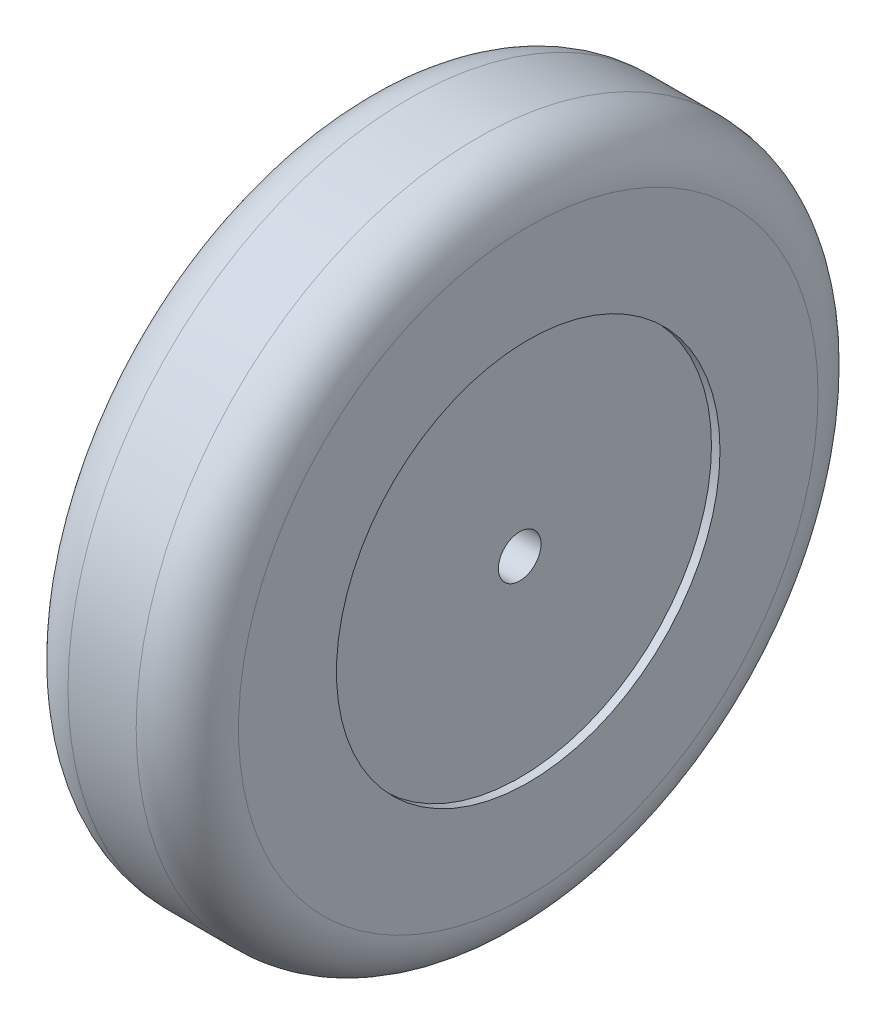
ISO-10303-21;
HEADER;
FILE_DESCRIPTION(('STEP AP214'),'2;1');
FILE_NAME('part.step','',(''),(''),'','','');
FILE_SCHEMA(('AUTOMOTIVE_DESIGN { 1 0 10303 214 1 1 1 1 }'));
ENDSEC;
DATA;
#1=APPLICATION_CONTEXT('core data for automotive mechanical design processes');
#2=APPLICATION_PROTOCOL_DEFINITION('international standard','automotive_design',2000,#1);
#3=PRODUCT_CONTEXT('',#1,'mechanical');
#4=PRODUCT('Part','Part','',(#3));
#5=PRODUCT_RELATED_PRODUCT_CATEGORY('part','',(#4));
#6=PRODUCT_DEFINITION_FORMATION('','',#4);
#7=PRODUCT_DEFINITION_CONTEXT('part definition',#1,'design');
#8=PRODUCT_DEFINITION('design','',#6,#7);
#9=PRODUCT_DEFINITION_SHAPE('','',#8);
#10=(LENGTH_UNIT() NAMED_UNIT(*) SI_UNIT(.MILLI.,.METRE.));
#11=(NAMED_UNIT(*) PLANE_ANGLE_UNIT() SI_UNIT($,.RADIAN.));
#12=(NAMED_UNIT(*) SI_UNIT($,.STERADIAN.) SOLID_ANGLE_UNIT());
#13=UNCERTAINTY_MEASURE_WITH_UNIT(LENGTH_MEASURE(1.E-05),#10,'distance_accuracy_value','');
#14=(GEOMETRIC_REPRESENTATION_CONTEXT(3) GLOBAL_UNCERTAINTY_ASSIGNED_CONTEXT((#13)) GLOBAL_UNIT_ASSIGNED_CONTEXT((#10,
#11,#12)) REPRESENTATION_CONTEXT('',''));
#15=CARTESIAN_POINT('',(0.,0.,0.));
#16=DIRECTION('',(0.,0.,1.));
#17=DIRECTION('',(1.,0.,0.));
#18=AXIS2_PLACEMENT_3D('',#15,#16,#17);
#19=CARTESIAN_POINT('',(-12.7,0.,0.));
#20=DIRECTION('',(1.,0.,0.));
#21=DIRECTION('',(0.,0.,-1.));
#22=AXIS2_PLACEMENT_3D('',#19,#20,#21);
#23=CYLINDRICAL_SURFACE('',#22,3.175);
#24=CARTESIAN_POINT('',(11.43,0.,0.));
#25=DIRECTION('',(1.,0.,0.));
#26=DIRECTION('',(0.,0.,-1.));
#27=AXIS2_PLACEMENT_3D('',#24,#25,#26);
#28=CIRCLE('',#27,3.175);
#29=CARTESIAN_POINT('',(11.43,0.,-3.175));
#30=VERTEX_POINT('',#29);
#31=EDGE_CURVE('E67',#30,#30,#28,.F.);
#32=ORIENTED_EDGE('',*,*,#31,.F.);
#33=EDGE_LOOP('',(#32));
#34=FACE_BOUND('',#33,.T.);
#35=CARTESIAN_POINT('',(-11.43,0.,0.));
#36=DIRECTION('',(-1.,0.,0.));
#37=DIRECTION('',(0.,0.,1.));
#38=AXIS2_PLACEMENT_3D('',#35,#36,#37);
#39=CIRCLE('',#38,3.175);
#40=CARTESIAN_POINT('',(-11.43,0.,3.175));
#41=VERTEX_POINT('',#40);
#42=EDGE_CURVE('E53',#41,#41,#39,.F.);
#43=ORIENTED_EDGE('',*,*,#42,.F.);
#44=EDGE_LOOP('',(#43));
#45=FACE_BOUND('',#44,.T.);
#46=ADVANCED_FACE('F49',(#34,#45),#23,.F.);
#47=CARTESIAN_POINT('',(12.7,0.,0.));
#48=DIRECTION('',(-1.,0.,0.));
#49=DIRECTION('',(0.,0.,1.));
#50=AXIS2_PLACEMENT_3D('',#47,#48,#49);
#51=CYLINDRICAL_SURFACE('',#50,50.8);
#52=CARTESIAN_POINT('',(-5.08,0.,0.));
#53=DIRECTION('',(1.,0.,0.));
#54=DIRECTION('',(0.,0.,-1.));
#55=AXIS2_PLACEMENT_3D('',#52,#53,#54);
#56=CIRCLE('',#55,50.8);
#57=CARTESIAN_POINT('',(-5.08,0.,-50.8));
#58=VERTEX_POINT('',#57);
#59=EDGE_CURVE('E64',#58,#58,#56,.T.);
#60=ORIENTED_EDGE('',*,*,#59,.T.);
#61=EDGE_LOOP('',(#60));
#62=FACE_BOUND('',#61,.T.);
#63=CARTESIAN_POINT('',(5.08,0.,0.));
#64=DIRECTION('',(1.,0.,0.));
#65=DIRECTION('',(0.,0.,-1.));
#66=AXIS2_PLACEMENT_3D('',#63,#64,#65);
#67=CIRCLE('',#66,50.8);
#68=CARTESIAN_POINT('',(5.08,0.,-50.8));
#69=VERTEX_POINT('',#68);
#70=EDGE_CURVE('E70',#69,#69,#67,.F.);
#71=ORIENTED_EDGE('',*,*,#70,.T.);
#72=EDGE_LOOP('',(#71));
#73=FACE_BOUND('',#72,.T.);
#74=ADVANCED_FACE('F93',(#62,#73),#51,.T.);
#75=CARTESIAN_POINT('',(12.7,0.,0.));
#76=DIRECTION('',(1.,0.,0.));
#77=DIRECTION('',(0.,0.,-1.));
#78=AXIS2_PLACEMENT_3D('',#75,#76,#77);
#79=PLANE('',#78);
#80=CARTESIAN_POINT('',(12.7,0.,0.));
#81=DIRECTION('',(1.,0.,0.));
#82=DIRECTION('',(0.,0.,-1.));
#83=AXIS2_PLACEMENT_3D('',#80,#81,#82);
#84=CIRCLE('',#83,28.575);
#85=CARTESIAN_POINT('',(12.7,0.,-28.575));
#86=VERTEX_POINT('',#85);
#87=EDGE_CURVE('E79',#86,#86,#84,.T.);
#88=ORIENTED_EDGE('',*,*,#87,.F.);
#89=EDGE_LOOP('',(#88));
#90=FACE_BOUND('',#89,.T.);
#91=CARTESIAN_POINT('',(12.7,0.,0.));
#92=DIRECTION('',(1.,0.,0.));
#93=DIRECTION('',(0.,0.,-1.));
#94=AXIS2_PLACEMENT_3D('',#91,#92,#93);
#95=CIRCLE('',#94,43.18);
#96=CARTESIAN_POINT('',(12.7,0.,-43.18));
#97=VERTEX_POINT('',#96);
#98=EDGE_CURVE('E10',#97,#97,#95,.T.);
#99=ORIENTED_EDGE('',*,*,#98,.T.);
#100=EDGE_LOOP('',(#99));
#101=FACE_BOUND('',#100,.T.);
#102=ADVANCED_FACE('F107',(#90,#101),#79,.T.);
#103=CARTESIAN_POINT('',(-12.7,0.,0.));
#104=DIRECTION('',(1.,0.,0.));
#105=DIRECTION('',(0.,0.,-1.));
#106=AXIS2_PLACEMENT_3D('',#103,#104,#105);
#107=PLANE('',#106);
#108=CARTESIAN_POINT('',(-12.7,0.,0.));
#109=DIRECTION('',(1.,0.,0.));
#110=DIRECTION('',(0.,0.,-1.));
#111=AXIS2_PLACEMENT_3D('',#108,#109,#110);
#112=CIRCLE('',#111,28.575);
#113=CARTESIAN_POINT('',(-12.7,0.,-28.575));
#114=VERTEX_POINT('',#113);
#115=EDGE_CURVE('E87',#114,#114,#112,.T.);
#116=ORIENTED_EDGE('',*,*,#115,.T.);
#117=EDGE_LOOP('',(#116));
#118=FACE_BOUND('',#117,.T.);
#119=CARTESIAN_POINT('',(-12.7,0.,0.));
#120=DIRECTION('',(1.,0.,0.));
#121=DIRECTION('',(0.,0.,-1.));
#122=AXIS2_PLACEMENT_3D('',#119,#120,#121);
#123=CIRCLE('',#122,43.18);
#124=CARTESIAN_POINT('',(-12.7,0.,-43.18));
#125=VERTEX_POINT('',#124);
#126=EDGE_CURVE('E58',#125,#125,#123,.F.);
#127=ORIENTED_EDGE('',*,*,#126,.T.);
#128=EDGE_LOOP('',(#127));
#129=FACE_BOUND('',#128,.T.);
#130=ADVANCED_FACE('F98',(#118,#129),#107,.F.);
#131=CARTESIAN_POINT('',(-5.08,0.,0.));
#132=DIRECTION('',(1.,0.,0.));
#133=DIRECTION('',(0.,0.,-1.));
#134=AXIS2_PLACEMENT_3D('',#131,#132,#133);
#135=TOROIDAL_SURFACE('',#134,43.18,7.62);
#136=ORIENTED_EDGE('',*,*,#126,.F.);
#137=EDGE_LOOP('',(#136));
#138=FACE_BOUND('',#137,.T.);
#139=ORIENTED_EDGE('',*,*,#59,.F.);
#140=EDGE_LOOP('',(#139));
#141=FACE_BOUND('',#140,.T.);
#142=ADVANCED_FACE('F96',(#138,#141),#135,.T.);
#143=CARTESIAN_POINT('',(5.08,0.,0.));
#144=DIRECTION('',(1.,0.,0.));
#145=DIRECTION('',(0.,0.,-1.));
#146=AXIS2_PLACEMENT_3D('',#143,#144,#145);
#147=TOROIDAL_SURFACE('',#146,43.18,7.62);
#148=ORIENTED_EDGE('',*,*,#70,.F.);
#149=EDGE_LOOP('',(#148));
#150=FACE_BOUND('',#149,.T.);
#151=ORIENTED_EDGE('',*,*,#98,.F.);
#152=EDGE_LOOP('',(#151));
#153=FACE_BOUND('',#152,.T.);
#154=ADVANCED_FACE('F51',(#150,#153),#147,.T.);
#155=CARTESIAN_POINT('',(11.43,0.,0.));
#156=DIRECTION('',(1.,0.,0.));
#157=DIRECTION('',(0.,0.,-1.));
#158=AXIS2_PLACEMENT_3D('',#155,#156,#157);
#159=PLANE('',#158);
#160=CARTESIAN_POINT('',(11.43,0.,0.));
#161=DIRECTION('',(1.,0.,0.));
#162=DIRECTION('',(0.,0.,-1.));
#163=AXIS2_PLACEMENT_3D('',#160,#161,#162);
#164=CIRCLE('',#163,28.575);
#165=CARTESIAN_POINT('',(11.43,0.,-28.575));
#166=VERTEX_POINT('',#165);
#167=EDGE_CURVE('E71',#166,#166,#164,.T.);
#168=ORIENTED_EDGE('',*,*,#167,.T.);
#169=EDGE_LOOP('',(#168));
#170=FACE_BOUND('',#169,.T.);
#171=ORIENTED_EDGE('',*,*,#31,.T.);
#172=EDGE_LOOP('',(#171));
#173=FACE_BOUND('',#172,.T.);
#174=ADVANCED_FACE('F104',(#170,#173),#159,.T.);
#175=CARTESIAN_POINT('',(11.43,0.,0.));
#176=DIRECTION('',(1.,0.,0.));
#177=DIRECTION('',(0.,0.,-1.));
#178=AXIS2_PLACEMENT_3D('',#175,#176,#177);
#179=CYLINDRICAL_SURFACE('',#178,28.575);
#180=ORIENTED_EDGE('',*,*,#167,.F.);
#181=EDGE_LOOP('',(#180));
#182=FACE_BOUND('',#181,.T.);
#183=ORIENTED_EDGE('',*,*,#87,.T.);
#184=EDGE_LOOP('',(#183));
#185=FACE_BOUND('',#184,.T.);
#186=ADVANCED_FACE('F121',(#182,#185),#179,.F.);
#187=CARTESIAN_POINT('',(-11.43,0.,0.));
#188=DIRECTION('',(-1.,0.,0.));
#189=DIRECTION('',(0.,0.,-1.));
#190=AXIS2_PLACEMENT_3D('',#187,#188,#189);
#191=PLANE('',#190);
#192=CARTESIAN_POINT('',(-11.43,0.,0.));
#193=DIRECTION('',(1.,0.,0.));
#194=DIRECTION('',(0.,0.,-1.));
#195=AXIS2_PLACEMENT_3D('',#192,#193,#194);
#196=CIRCLE('',#195,28.575);
#197=CARTESIAN_POINT('',(-11.43,0.,-28.575));
#198=VERTEX_POINT('',#197);
#199=EDGE_CURVE('E151',#198,#198,#196,.T.);
#200=ORIENTED_EDGE('',*,*,#199,.F.);
#201=EDGE_LOOP('',(#200));
#202=FACE_BOUND('',#201,.T.);
#203=ORIENTED_EDGE('',*,*,#42,.T.);
#204=EDGE_LOOP('',(#203));
#205=FACE_BOUND('',#204,.T.);
#206=ADVANCED_FACE('F131',(#202,#205),#191,.T.);
#207=CARTESIAN_POINT('',(-11.43,0.,0.));
#208=DIRECTION('',(-1.,0.,0.));
#209=DIRECTION('',(0.,0.,1.));
#210=AXIS2_PLACEMENT_3D('',#207,#208,#209);
#211=CYLINDRICAL_SURFACE('',#210,28.575);
#212=ORIENTED_EDGE('',*,*,#199,.T.);
#213=EDGE_LOOP('',(#212));
#214=FACE_BOUND('',#213,.T.);
#215=ORIENTED_EDGE('',*,*,#115,.F.);
#216=EDGE_LOOP('',(#215));
#217=FACE_BOUND('',#216,.T.);
#218=ADVANCED_FACE('F137',(#214,#217),#211,.F.);
#219=CLOSED_SHELL('',(#46,#74,#102,#130,#142,#154,#174,#186,#206,#218));
#220=MANIFOLD_SOLID_BREP('B2',#219);
#221=ADVANCED_BREP_SHAPE_REPRESENTATION('',(#18,#220),#14);
#222=SHAPE_DEFINITION_REPRESENTATION(#9,#221);
ENDSEC;
END-ISO-10303-21;
